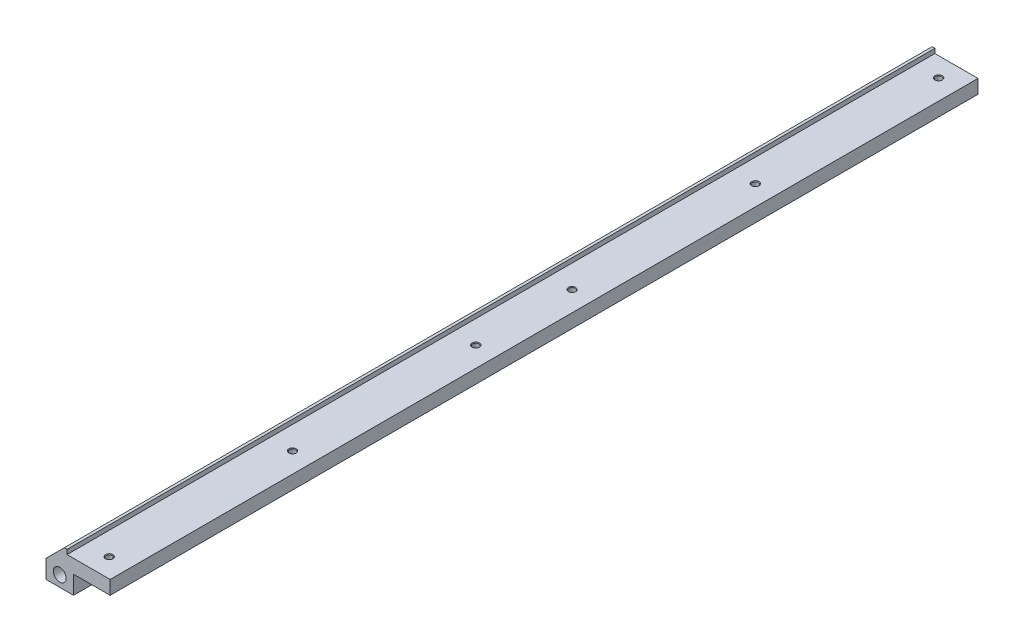
ISO-10303-21;
HEADER;
FILE_DESCRIPTION(('STEP AP214'),'2;1');
FILE_NAME('part.step','',(''),(''),'','','');
FILE_SCHEMA(('AUTOMOTIVE_DESIGN { 1 0 10303 214 1 1 1 1 }'));
ENDSEC;
DATA;
#1=APPLICATION_CONTEXT('core data for automotive mechanical design processes');
#2=APPLICATION_PROTOCOL_DEFINITION('international standard','automotive_design',2000,#1);
#3=PRODUCT_CONTEXT('',#1,'mechanical');
#4=PRODUCT('Part','Part','',(#3));
#5=PRODUCT_RELATED_PRODUCT_CATEGORY('part','',(#4));
#6=PRODUCT_DEFINITION_FORMATION('','',#4);
#7=PRODUCT_DEFINITION_CONTEXT('part definition',#1,'design');
#8=PRODUCT_DEFINITION('design','',#6,#7);
#9=PRODUCT_DEFINITION_SHAPE('','',#8);
#10=(LENGTH_UNIT() NAMED_UNIT(*) SI_UNIT(.MILLI.,.METRE.));
#11=(NAMED_UNIT(*) PLANE_ANGLE_UNIT() SI_UNIT($,.RADIAN.));
#12=(NAMED_UNIT(*) SI_UNIT($,.STERADIAN.) SOLID_ANGLE_UNIT());
#13=UNCERTAINTY_MEASURE_WITH_UNIT(LENGTH_MEASURE(1.E-05),#10,'distance_accuracy_value','');
#14=(GEOMETRIC_REPRESENTATION_CONTEXT(3) GLOBAL_UNCERTAINTY_ASSIGNED_CONTEXT((#13)) GLOBAL_UNIT_ASSIGNED_CONTEXT((#10,
#11,#12)) REPRESENTATION_CONTEXT('',''));
#15=CARTESIAN_POINT('',(0.,0.,0.));
#16=DIRECTION('',(0.,0.,1.));
#17=DIRECTION('',(1.,0.,0.));
#18=AXIS2_PLACEMENT_3D('',#15,#16,#17);
#19=CARTESIAN_POINT('',(-15.,28.,473.5));
#20=DIRECTION('',(1.,0.,0.));
#21=DIRECTION('',(0.,1.,0.));
#22=AXIS2_PLACEMENT_3D('',#19,#20,#21);
#23=PLANE('',#22);
#24=DIRECTION('',(0.,-1.,0.));
#25=VECTOR('',#24,1.);
#26=CARTESIAN_POINT('',(-15.,28.,473.5));
#27=LINE('',#26,#25);
#28=CARTESIAN_POINT('',(-15.,7.99999999999998,473.5));
#29=VERTEX_POINT('',#28);
#30=CARTESIAN_POINT('',(-15.,-12.,473.5));
#31=VERTEX_POINT('',#30);
#32=EDGE_CURVE('E286',#29,#31,#27,.T.);
#33=ORIENTED_EDGE('',*,*,#32,.F.);
#34=DIRECTION('',(0.,0.,-1.));
#35=VECTOR('',#34,1.);
#36=CARTESIAN_POINT('',(-15.,7.99999999999998,473.5));
#37=LINE('',#36,#35);
#38=CARTESIAN_POINT('',(-15.,7.99999999999998,-473.5));
#39=VERTEX_POINT('',#38);
#40=EDGE_CURVE('E323',#29,#39,#37,.T.);
#41=ORIENTED_EDGE('',*,*,#40,.T.);
#42=DIRECTION('',(0.,-1.,0.));
#43=VECTOR('',#42,1.);
#44=CARTESIAN_POINT('',(-15.,28.,-473.5));
#45=LINE('',#44,#43);
#46=CARTESIAN_POINT('',(-15.,-12.,-473.5));
#47=VERTEX_POINT('',#46);
#48=EDGE_CURVE('E285',#39,#47,#45,.T.);
#49=ORIENTED_EDGE('',*,*,#48,.T.);
#50=DIRECTION('',(0.,0.,-1.));
#51=VECTOR('',#50,1.);
#52=CARTESIAN_POINT('',(-15.,-12.,473.5));
#53=LINE('',#52,#51);
#54=EDGE_CURVE('E320',#31,#47,#53,.T.);
#55=ORIENTED_EDGE('',*,*,#54,.F.);
#56=EDGE_LOOP('',(#33,#41,#49,#55));
#57=FACE_BOUND('',#56,.T.);
#58=ADVANCED_FACE('F37',(#57),#23,.F.);
#59=CARTESIAN_POINT('',(-15.,-12.,473.5));
#60=DIRECTION('',(0.,1.,0.));
#61=DIRECTION('',(0.,0.,1.));
#62=AXIS2_PLACEMENT_3D('',#59,#60,#61);
#63=PLANE('',#62);
#64=DIRECTION('',(1.,0.,0.));
#65=VECTOR('',#64,1.);
#66=CARTESIAN_POINT('',(-15.,-12.,-473.5));
#67=LINE('',#66,#65);
#68=CARTESIAN_POINT('',(14.9999999999999,-12.,-473.5));
#69=VERTEX_POINT('',#68);
#70=EDGE_CURVE('E302',#47,#69,#67,.T.);
#71=ORIENTED_EDGE('',*,*,#70,.T.);
#72=DIRECTION('',(0.,0.,-1.));
#73=VECTOR('',#72,1.);
#74=CARTESIAN_POINT('',(14.9999999999999,-12.,-373.5));
#75=LINE('',#74,#73);
#76=CARTESIAN_POINT('',(14.9999999999999,-12.,-373.5));
#77=VERTEX_POINT('',#76);
#78=EDGE_CURVE('E173',#77,#69,#75,.T.);
#79=ORIENTED_EDGE('',*,*,#78,.F.);
#80=DIRECTION('',(1.,0.,0.));
#81=VECTOR('',#80,1.);
#82=CARTESIAN_POINT('',(14.9999999999999,-12.,-373.5));
#83=LINE('',#82,#81);
#84=CARTESIAN_POINT('',(11.,-12.,-373.5));
#85=VERTEX_POINT('',#84);
#86=EDGE_CURVE('E213',#85,#77,#83,.T.);
#87=ORIENTED_EDGE('',*,*,#86,.F.);
#88=CARTESIAN_POINT('',(11.,-12.,-352.5));
#89=DIRECTION('',(0.,-1.,0.));
#90=DIRECTION('',(0.,0.,1.));
#91=AXIS2_PLACEMENT_3D('',#88,#89,#90);
#92=CIRCLE('',#91,21.);
#93=CARTESIAN_POINT('',(-10.,-12.,-352.5));
#94=VERTEX_POINT('',#93);
#95=EDGE_CURVE('E210',#94,#85,#92,.T.);
#96=ORIENTED_EDGE('',*,*,#95,.F.);
#97=DIRECTION('',(0.,0.,-1.));
#98=VECTOR('',#97,1.);
#99=CARTESIAN_POINT('',(-10.,-12.,-352.5));
#100=LINE('',#99,#98);
#101=CARTESIAN_POINT('',(-10.,-12.,352.5));
#102=VERTEX_POINT('',#101);
#103=EDGE_CURVE('E207',#102,#94,#100,.T.);
#104=ORIENTED_EDGE('',*,*,#103,.F.);
#105=CARTESIAN_POINT('',(11.,-12.,352.5));
#106=DIRECTION('',(0.,-1.,0.));
#107=DIRECTION('',(0.,0.,-1.));
#108=AXIS2_PLACEMENT_3D('',#105,#106,#107);
#109=CIRCLE('',#108,21.);
#110=CARTESIAN_POINT('',(11.,-12.,373.5));
#111=VERTEX_POINT('',#110);
#112=EDGE_CURVE('E204',#111,#102,#109,.T.);
#113=ORIENTED_EDGE('',*,*,#112,.F.);
#114=DIRECTION('',(-1.,0.,0.));
#115=VECTOR('',#114,1.);
#116=CARTESIAN_POINT('',(14.9999999999998,-12.,373.5));
#117=LINE('',#116,#115);
#118=CARTESIAN_POINT('',(14.9999999999998,-12.,373.5));
#119=VERTEX_POINT('',#118);
#120=EDGE_CURVE('E201',#119,#111,#117,.T.);
#121=ORIENTED_EDGE('',*,*,#120,.F.);
#122=DIRECTION('',(0.,0.,-1.));
#123=VECTOR('',#122,1.);
#124=CARTESIAN_POINT('',(14.9999999999999,-12.,473.5));
#125=LINE('',#124,#123);
#126=CARTESIAN_POINT('',(14.9999999999999,-12.,473.5));
#127=VERTEX_POINT('',#126);
#128=EDGE_CURVE('E169',#127,#119,#125,.T.);
#129=ORIENTED_EDGE('',*,*,#128,.F.);
#130=DIRECTION('',(1.,0.,0.));
#131=VECTOR('',#130,1.);
#132=CARTESIAN_POINT('',(-15.,-12.,473.5));
#133=LINE('',#132,#131);
#134=EDGE_CURVE('E288',#31,#127,#133,.T.);
#135=ORIENTED_EDGE('',*,*,#134,.F.);
#136=ORIENTED_EDGE('',*,*,#54,.T.);
#137=EDGE_LOOP('',(#71,#79,#87,#96,#104,#113,#121,#129,#135,#136));
#138=FACE_BOUND('',#137,.T.);
#139=ADVANCED_FACE('F341',(#138),#63,.F.);
#140=CARTESIAN_POINT('',(55.,23.,473.5));
#141=DIRECTION('',(-1.,0.,0.));
#142=DIRECTION('',(0.,0.,1.));
#143=AXIS2_PLACEMENT_3D('',#140,#141,#142);
#144=PLANE('',#143);
#145=DIRECTION('',(0.,1.,0.));
#146=VECTOR('',#145,1.);
#147=CARTESIAN_POINT('',(55.,23.,473.5));
#148=LINE('',#147,#146);
#149=CARTESIAN_POINT('',(55.,8.,473.5));
#150=VERTEX_POINT('',#149);
#151=CARTESIAN_POINT('',(55.,23.,473.5));
#152=VERTEX_POINT('',#151);
#153=EDGE_CURVE('E292',#150,#152,#148,.T.);
#154=ORIENTED_EDGE('',*,*,#153,.F.);
#155=DIRECTION('',(0.,0.,1.));
#156=VECTOR('',#155,1.);
#157=CARTESIAN_POINT('',(55.,8.,473.5));
#158=LINE('',#157,#156);
#159=CARTESIAN_POINT('',(55.0000000000001,8.,-473.5));
#160=VERTEX_POINT('',#159);
#161=EDGE_CURVE('E170',#160,#150,#158,.T.);
#162=ORIENTED_EDGE('',*,*,#161,.F.);
#163=DIRECTION('',(0.,1.,0.));
#164=VECTOR('',#163,1.);
#165=CARTESIAN_POINT('',(55.,23.,-473.5));
#166=LINE('',#165,#164);
#167=CARTESIAN_POINT('',(55.,23.,-473.5));
#168=VERTEX_POINT('',#167);
#169=EDGE_CURVE('E305',#160,#168,#166,.T.);
#170=ORIENTED_EDGE('',*,*,#169,.T.);
#171=DIRECTION('',(0.,0.,-1.));
#172=VECTOR('',#171,1.);
#173=CARTESIAN_POINT('',(55.,23.,473.5));
#174=LINE('',#173,#172);
#175=EDGE_CURVE('E317',#152,#168,#174,.T.);
#176=ORIENTED_EDGE('',*,*,#175,.F.);
#177=EDGE_LOOP('',(#154,#162,#170,#176));
#178=FACE_BOUND('',#177,.T.);
#179=ADVANCED_FACE('F364',(#178),#144,.F.);
#180=CARTESIAN_POINT('',(8.,23.,473.5));
#181=DIRECTION('',(0.,-1.,0.));
#182=DIRECTION('',(0.,0.,-1.));
#183=AXIS2_PLACEMENT_3D('',#180,#181,#182);
#184=PLANE('',#183);
#185=CARTESIAN_POINT('',(33.,23.,452.5));
#186=DIRECTION('',(0.,1.,0.));
#187=DIRECTION('',(0.,0.,1.));
#188=AXIS2_PLACEMENT_3D('',#185,#186,#187);
#189=CIRCLE('',#188,4.025);
#190=CARTESIAN_POINT('',(33.,23.,456.525));
#191=VERTEX_POINT('',#190);
#192=EDGE_CURVE('E249',#191,#191,#189,.T.);
#193=ORIENTED_EDGE('',*,*,#192,.F.);
#194=EDGE_LOOP('',(#193));
#195=FACE_BOUND('',#194,.T.);
#196=CARTESIAN_POINT('',(33.,23.,-52.5));
#197=DIRECTION('',(0.,1.,0.));
#198=DIRECTION('',(0.,0.,1.));
#199=AXIS2_PLACEMENT_3D('',#196,#197,#198);
#200=CIRCLE('',#199,4.025);
#201=CARTESIAN_POINT('',(33.,23.,-48.475));
#202=VERTEX_POINT('',#201);
#203=EDGE_CURVE('E255',#202,#202,#200,.T.);
#204=ORIENTED_EDGE('',*,*,#203,.F.);
#205=EDGE_LOOP('',(#204));
#206=FACE_BOUND('',#205,.T.);
#207=CARTESIAN_POINT('',(33.,23.,252.5));
#208=DIRECTION('',(0.,1.,0.));
#209=DIRECTION('',(0.,0.,1.));
#210=AXIS2_PLACEMENT_3D('',#207,#208,#209);
#211=CIRCLE('',#210,4.025);
#212=CARTESIAN_POINT('',(33.,23.,256.525));
#213=VERTEX_POINT('',#212);
#214=EDGE_CURVE('E261',#213,#213,#211,.T.);
#215=ORIENTED_EDGE('',*,*,#214,.F.);
#216=EDGE_LOOP('',(#215));
#217=FACE_BOUND('',#216,.T.);
#218=CARTESIAN_POINT('',(33.,23.,-252.5));
#219=DIRECTION('',(0.,1.,0.));
#220=DIRECTION('',(0.,0.,1.));
#221=AXIS2_PLACEMENT_3D('',#218,#219,#220);
#222=CIRCLE('',#221,4.025);
#223=CARTESIAN_POINT('',(33.,23.,-248.475));
#224=VERTEX_POINT('',#223);
#225=EDGE_CURVE('E267',#224,#224,#222,.T.);
#226=ORIENTED_EDGE('',*,*,#225,.F.);
#227=EDGE_LOOP('',(#226));
#228=FACE_BOUND('',#227,.T.);
#229=CARTESIAN_POINT('',(33.,23.,52.5));
#230=DIRECTION('',(0.,1.,0.));
#231=DIRECTION('',(0.,0.,1.));
#232=AXIS2_PLACEMENT_3D('',#229,#230,#231);
#233=CIRCLE('',#232,4.025);
#234=CARTESIAN_POINT('',(33.,23.,56.525));
#235=VERTEX_POINT('',#234);
#236=EDGE_CURVE('E273',#235,#235,#233,.T.);
#237=ORIENTED_EDGE('',*,*,#236,.F.);
#238=EDGE_LOOP('',(#237));
#239=FACE_BOUND('',#238,.T.);
#240=CARTESIAN_POINT('',(33.,23.,-452.5));
#241=DIRECTION('',(0.,1.,0.));
#242=DIRECTION('',(0.,0.,1.));
#243=AXIS2_PLACEMENT_3D('',#240,#241,#242);
#244=CIRCLE('',#243,4.025);
#245=CARTESIAN_POINT('',(33.,23.,-448.475));
#246=VERTEX_POINT('',#245);
#247=EDGE_CURVE('E279',#246,#246,#244,.T.);
#248=ORIENTED_EDGE('',*,*,#247,.F.);
#249=EDGE_LOOP('',(#248));
#250=FACE_BOUND('',#249,.T.);
#251=DIRECTION('',(-1.,0.,0.));
#252=VECTOR('',#251,1.);
#253=CARTESIAN_POINT('',(8.,23.,-473.5));
#254=LINE('',#253,#252);
#255=CARTESIAN_POINT('',(8.,23.,-473.5));
#256=VERTEX_POINT('',#255);
#257=EDGE_CURVE('E307',#168,#256,#254,.T.);
#258=ORIENTED_EDGE('',*,*,#257,.T.);
#259=DIRECTION('',(0.,0.,-1.));
#260=VECTOR('',#259,1.);
#261=CARTESIAN_POINT('',(8.,23.,473.5));
#262=LINE('',#261,#260);
#263=CARTESIAN_POINT('',(8.,23.,473.5));
#264=VERTEX_POINT('',#263);
#265=EDGE_CURVE('E314',#264,#256,#262,.T.);
#266=ORIENTED_EDGE('',*,*,#265,.F.);
#267=DIRECTION('',(-1.,0.,0.));
#268=VECTOR('',#267,1.);
#269=CARTESIAN_POINT('',(8.,23.,473.5));
#270=LINE('',#269,#268);
#271=EDGE_CURVE('E294',#152,#264,#270,.T.);
#272=ORIENTED_EDGE('',*,*,#271,.F.);
#273=ORIENTED_EDGE('',*,*,#175,.T.);
#274=EDGE_LOOP('',(#258,#266,#272,#273));
#275=FACE_BOUND('',#274,.T.);
#276=ADVANCED_FACE('F369',(#195,#206,#217,#228,#239,#250,#275),#184,.F.);
#277=CARTESIAN_POINT('',(8.,28.,473.5));
#278=DIRECTION('',(-1.,0.,0.));
#279=DIRECTION('',(0.,0.,1.));
#280=AXIS2_PLACEMENT_3D('',#277,#278,#279);
#281=PLANE('',#280);
#282=DIRECTION('',(0.,1.,0.));
#283=VECTOR('',#282,1.);
#284=CARTESIAN_POINT('',(8.,28.,-473.5));
#285=LINE('',#284,#283);
#286=CARTESIAN_POINT('',(8.,28.,-473.5));
#287=VERTEX_POINT('',#286);
#288=EDGE_CURVE('E309',#256,#287,#285,.T.);
#289=ORIENTED_EDGE('',*,*,#288,.T.);
#290=DIRECTION('',(0.,0.,-1.));
#291=VECTOR('',#290,1.);
#292=CARTESIAN_POINT('',(8.,28.,473.5));
#293=LINE('',#292,#291);
#294=CARTESIAN_POINT('',(8.,28.,473.5));
#295=VERTEX_POINT('',#294);
#296=EDGE_CURVE('E300',#295,#287,#293,.T.);
#297=ORIENTED_EDGE('',*,*,#296,.F.);
#298=DIRECTION('',(0.,1.,0.));
#299=VECTOR('',#298,1.);
#300=CARTESIAN_POINT('',(8.,28.,473.5));
#301=LINE('',#300,#299);
#302=EDGE_CURVE('E296',#264,#295,#301,.T.);
#303=ORIENTED_EDGE('',*,*,#302,.F.);
#304=ORIENTED_EDGE('',*,*,#265,.T.);
#305=EDGE_LOOP('',(#289,#297,#303,#304));
#306=FACE_BOUND('',#305,.T.);
#307=ADVANCED_FACE('F373',(#306),#281,.F.);
#308=CARTESIAN_POINT('',(-15.,28.,473.5));
#309=DIRECTION('',(0.,-1.,0.));
#310=DIRECTION('',(0.,0.,-1.));
#311=AXIS2_PLACEMENT_3D('',#308,#309,#310);
#312=PLANE('',#311);
#313=DIRECTION('',(-1.,0.,0.));
#314=VECTOR('',#313,1.);
#315=CARTESIAN_POINT('',(-15.,28.,-473.5));
#316=LINE('',#315,#314);
#317=CARTESIAN_POINT('',(5.00000000000013,28.,-473.5));
#318=VERTEX_POINT('',#317);
#319=EDGE_CURVE('E289',#287,#318,#316,.T.);
#320=ORIENTED_EDGE('',*,*,#319,.T.);
#321=DIRECTION('',(0.,0.,1.));
#322=VECTOR('',#321,1.);
#323=CARTESIAN_POINT('',(5.00000000000013,28.,473.5));
#324=LINE('',#323,#322);
#325=CARTESIAN_POINT('',(5.00000000000013,28.,473.5));
#326=VERTEX_POINT('',#325);
#327=EDGE_CURVE('E45',#318,#326,#324,.T.);
#328=ORIENTED_EDGE('',*,*,#327,.T.);
#329=DIRECTION('',(-1.,0.,0.));
#330=VECTOR('',#329,1.);
#331=CARTESIAN_POINT('',(-15.,28.,473.5));
#332=LINE('',#331,#330);
#333=EDGE_CURVE('E298',#295,#326,#332,.T.);
#334=ORIENTED_EDGE('',*,*,#333,.F.);
#335=ORIENTED_EDGE('',*,*,#296,.T.);
#336=EDGE_LOOP('',(#320,#328,#334,#335));
#337=FACE_BOUND('',#336,.T.);
#338=ADVANCED_FACE('F377',(#337),#312,.F.);
#339=CARTESIAN_POINT('',(-15.,-12.,473.5));
#340=DIRECTION('',(0.,0.,1.));
#341=DIRECTION('',(1.,0.,0.));
#342=AXIS2_PLACEMENT_3D('',#339,#340,#341);
#343=PLANE('',#342);
#344=CARTESIAN_POINT('',(0.,0.,473.5));
#345=DIRECTION('',(0.,0.,1.));
#346=DIRECTION('',(1.,0.,0.));
#347=AXIS2_PLACEMENT_3D('',#344,#345,#346);
#348=CIRCLE('',#347,6.99999999999999);
#349=CARTESIAN_POINT('',(6.99999999999999,0.,473.5));
#350=VERTEX_POINT('',#349);
#351=EDGE_CURVE('E158',#350,#350,#348,.T.);
#352=ORIENTED_EDGE('',*,*,#351,.F.);
#353=EDGE_LOOP('',(#352));
#354=FACE_BOUND('',#353,.T.);
#355=ORIENTED_EDGE('',*,*,#333,.T.);
#356=DIRECTION('',(0.707106781186549,0.707106781186546,0.));
#357=VECTOR('',#356,1.);
#358=CARTESIAN_POINT('',(-25.,-1.99999999999995,473.5));
#359=LINE('',#358,#357);
#360=EDGE_CURVE('E11',#326,#29,#359,.F.);
#361=ORIENTED_EDGE('',*,*,#360,.T.);
#362=ORIENTED_EDGE('',*,*,#32,.T.);
#363=ORIENTED_EDGE('',*,*,#134,.T.);
#364=DIRECTION('',(0.,-1.,0.));
#365=VECTOR('',#364,1.);
#366=CARTESIAN_POINT('',(14.9999999999999,8.,473.5));
#367=LINE('',#366,#365);
#368=CARTESIAN_POINT('',(14.9999999999999,8.,473.5));
#369=VERTEX_POINT('',#368);
#370=EDGE_CURVE('E198',#369,#127,#367,.T.);
#371=ORIENTED_EDGE('',*,*,#370,.F.);
#372=DIRECTION('',(-1.,0.,0.));
#373=VECTOR('',#372,1.);
#374=CARTESIAN_POINT('',(55.,8.,473.5));
#375=LINE('',#374,#373);
#376=EDGE_CURVE('E172',#150,#369,#375,.T.);
#377=ORIENTED_EDGE('',*,*,#376,.F.);
#378=ORIENTED_EDGE('',*,*,#153,.T.);
#379=ORIENTED_EDGE('',*,*,#271,.T.);
#380=ORIENTED_EDGE('',*,*,#302,.T.);
#381=EDGE_LOOP('',(#355,#361,#362,#363,#371,#377,#378,#379,#380));
#382=FACE_BOUND('',#381,.T.);
#383=ADVANCED_FACE('F346',(#354,#382),#343,.T.);
#384=CARTESIAN_POINT('',(-15.,-12.,-473.5));
#385=DIRECTION('',(0.,0.,1.));
#386=DIRECTION('',(1.,0.,0.));
#387=AXIS2_PLACEMENT_3D('',#384,#385,#386);
#388=PLANE('',#387);
#389=CARTESIAN_POINT('',(0.,0.,-473.5));
#390=DIRECTION('',(0.,0.,-1.));
#391=DIRECTION('',(-1.,0.,0.));
#392=AXIS2_PLACEMENT_3D('',#389,#390,#391);
#393=CIRCLE('',#392,6.99999999999999);
#394=CARTESIAN_POINT('',(-6.99999999999999,0.,-473.5));
#395=VERTEX_POINT('',#394);
#396=EDGE_CURVE('E159',#395,#395,#393,.T.);
#397=ORIENTED_EDGE('',*,*,#396,.F.);
#398=EDGE_LOOP('',(#397));
#399=FACE_BOUND('',#398,.T.);
#400=ORIENTED_EDGE('',*,*,#48,.F.);
#401=DIRECTION('',(-0.707106781186549,-0.707106781186546,0.));
#402=VECTOR('',#401,1.);
#403=CARTESIAN_POINT('',(-15.,7.99999999999998,-473.5));
#404=LINE('',#403,#402);
#405=EDGE_CURVE('E59',#39,#318,#404,.F.);
#406=ORIENTED_EDGE('',*,*,#405,.T.);
#407=ORIENTED_EDGE('',*,*,#319,.F.);
#408=ORIENTED_EDGE('',*,*,#288,.F.);
#409=ORIENTED_EDGE('',*,*,#257,.F.);
#410=ORIENTED_EDGE('',*,*,#169,.F.);
#411=DIRECTION('',(1.,0.,0.));
#412=VECTOR('',#411,1.);
#413=CARTESIAN_POINT('',(55.0000000000001,8.,-473.5));
#414=LINE('',#413,#412);
#415=CARTESIAN_POINT('',(14.9999999999999,8.,-473.5));
#416=VERTEX_POINT('',#415);
#417=EDGE_CURVE('E196',#416,#160,#414,.T.);
#418=ORIENTED_EDGE('',*,*,#417,.F.);
#419=DIRECTION('',(0.,-1.,0.));
#420=VECTOR('',#419,1.);
#421=CARTESIAN_POINT('',(14.9999999999999,8.,-473.5));
#422=LINE('',#421,#420);
#423=EDGE_CURVE('E217',#416,#69,#422,.T.);
#424=ORIENTED_EDGE('',*,*,#423,.T.);
#425=ORIENTED_EDGE('',*,*,#70,.F.);
#426=EDGE_LOOP('',(#400,#406,#407,#408,#409,#410,#418,#424,#425));
#427=FACE_BOUND('',#426,.T.);
#428=ADVANCED_FACE('F335',(#399,#427),#388,.F.);
#429=CARTESIAN_POINT('',(33.,23.,-452.5));
#430=DIRECTION('',(0.,1.,0.));
#431=DIRECTION('',(0.,0.,1.));
#432=AXIS2_PLACEMENT_3D('',#429,#430,#431);
#433=CYLINDRICAL_SURFACE('',#432,3.4);
#434=CARTESIAN_POINT('',(33.,8.,-452.5));
#435=DIRECTION('',(0.,1.,0.));
#436=DIRECTION('',(0.,0.,1.));
#437=AXIS2_PLACEMENT_3D('',#434,#435,#436);
#438=CIRCLE('',#437,3.4);
#439=CARTESIAN_POINT('',(33.,8.,-449.1));
#440=VERTEX_POINT('',#439);
#441=EDGE_CURVE('E246',#440,#440,#438,.F.);
#442=ORIENTED_EDGE('',*,*,#441,.T.);
#443=EDGE_LOOP('',(#442));
#444=FACE_BOUND('',#443,.T.);
#445=CARTESIAN_POINT('',(33.,22.375,-452.5));
#446=DIRECTION('',(0.,1.,0.));
#447=DIRECTION('',(0.,0.,1.));
#448=AXIS2_PLACEMENT_3D('',#445,#446,#447);
#449=CIRCLE('',#448,3.4);
#450=CARTESIAN_POINT('',(33.,22.375,-449.1));
#451=VERTEX_POINT('',#450);
#452=EDGE_CURVE('E282',#451,#451,#449,.T.);
#453=ORIENTED_EDGE('',*,*,#452,.T.);
#454=EDGE_LOOP('',(#453));
#455=FACE_BOUND('',#454,.T.);
#456=ADVANCED_FACE('F383',(#444,#455),#433,.F.);
#457=CARTESIAN_POINT('',(33.,23.,-452.5));
#458=DIRECTION('',(0.,1.,0.));
#459=DIRECTION('',(0.,0.,1.));
#460=AXIS2_PLACEMENT_3D('',#457,#458,#459);
#461=CONICAL_SURFACE('',#460,4.025,0.785398163397446);
#462=ORIENTED_EDGE('',*,*,#452,.F.);
#463=EDGE_LOOP('',(#462));
#464=FACE_BOUND('',#463,.T.);
#465=ORIENTED_EDGE('',*,*,#247,.T.);
#466=EDGE_LOOP('',(#465));
#467=FACE_BOUND('',#466,.T.);
#468=ADVANCED_FACE('F390',(#464,#467),#461,.F.);
#469=CARTESIAN_POINT('',(33.,23.,52.5));
#470=DIRECTION('',(0.,1.,0.));
#471=DIRECTION('',(0.,0.,1.));
#472=AXIS2_PLACEMENT_3D('',#469,#470,#471);
#473=CYLINDRICAL_SURFACE('',#472,3.4);
#474=CARTESIAN_POINT('',(33.,8.,52.5));
#475=DIRECTION('',(0.,1.,0.));
#476=DIRECTION('',(0.,0.,1.));
#477=AXIS2_PLACEMENT_3D('',#474,#475,#476);
#478=CIRCLE('',#477,3.4);
#479=CARTESIAN_POINT('',(33.,8.,55.9));
#480=VERTEX_POINT('',#479);
#481=EDGE_CURVE('E243',#480,#480,#478,.F.);
#482=ORIENTED_EDGE('',*,*,#481,.T.);
#483=EDGE_LOOP('',(#482));
#484=FACE_BOUND('',#483,.T.);
#485=CARTESIAN_POINT('',(33.,22.375,52.5));
#486=DIRECTION('',(0.,1.,0.));
#487=DIRECTION('',(0.,0.,1.));
#488=AXIS2_PLACEMENT_3D('',#485,#486,#487);
#489=CIRCLE('',#488,3.4);
#490=CARTESIAN_POINT('',(33.,22.375,55.9));
#491=VERTEX_POINT('',#490);
#492=EDGE_CURVE('E276',#491,#491,#489,.T.);
#493=ORIENTED_EDGE('',*,*,#492,.T.);
#494=EDGE_LOOP('',(#493));
#495=FACE_BOUND('',#494,.T.);
#496=ADVANCED_FACE('F394',(#484,#495),#473,.F.);
#497=CARTESIAN_POINT('',(33.,23.,52.5));
#498=DIRECTION('',(0.,1.,0.));
#499=DIRECTION('',(0.,0.,1.));
#500=AXIS2_PLACEMENT_3D('',#497,#498,#499);
#501=CONICAL_SURFACE('',#500,4.025,0.785398163397446);
#502=ORIENTED_EDGE('',*,*,#492,.F.);
#503=EDGE_LOOP('',(#502));
#504=FACE_BOUND('',#503,.T.);
#505=ORIENTED_EDGE('',*,*,#236,.T.);
#506=EDGE_LOOP('',(#505));
#507=FACE_BOUND('',#506,.T.);
#508=ADVANCED_FACE('F398',(#504,#507),#501,.F.);
#509=CARTESIAN_POINT('',(33.,23.,-252.5));
#510=DIRECTION('',(0.,1.,0.));
#511=DIRECTION('',(0.,0.,1.));
#512=AXIS2_PLACEMENT_3D('',#509,#510,#511);
#513=CYLINDRICAL_SURFACE('',#512,3.4);
#514=CARTESIAN_POINT('',(33.,8.,-252.5));
#515=DIRECTION('',(0.,1.,0.));
#516=DIRECTION('',(0.,0.,1.));
#517=AXIS2_PLACEMENT_3D('',#514,#515,#516);
#518=CIRCLE('',#517,3.4);
#519=CARTESIAN_POINT('',(33.,8.,-249.1));
#520=VERTEX_POINT('',#519);
#521=EDGE_CURVE('E240',#520,#520,#518,.F.);
#522=ORIENTED_EDGE('',*,*,#521,.T.);
#523=EDGE_LOOP('',(#522));
#524=FACE_BOUND('',#523,.T.);
#525=CARTESIAN_POINT('',(33.,22.375,-252.5));
#526=DIRECTION('',(0.,1.,0.));
#527=DIRECTION('',(0.,0.,1.));
#528=AXIS2_PLACEMENT_3D('',#525,#526,#527);
#529=CIRCLE('',#528,3.4);
#530=CARTESIAN_POINT('',(33.,22.375,-249.1));
#531=VERTEX_POINT('',#530);
#532=EDGE_CURVE('E270',#531,#531,#529,.T.);
#533=ORIENTED_EDGE('',*,*,#532,.T.);
#534=EDGE_LOOP('',(#533));
#535=FACE_BOUND('',#534,.T.);
#536=ADVANCED_FACE('F402',(#524,#535),#513,.F.);
#537=CARTESIAN_POINT('',(33.,23.,-252.5));
#538=DIRECTION('',(0.,1.,0.));
#539=DIRECTION('',(0.,0.,1.));
#540=AXIS2_PLACEMENT_3D('',#537,#538,#539);
#541=CONICAL_SURFACE('',#540,4.025,0.785398163397446);
#542=ORIENTED_EDGE('',*,*,#532,.F.);
#543=EDGE_LOOP('',(#542));
#544=FACE_BOUND('',#543,.T.);
#545=ORIENTED_EDGE('',*,*,#225,.T.);
#546=EDGE_LOOP('',(#545));
#547=FACE_BOUND('',#546,.T.);
#548=ADVANCED_FACE('F406',(#544,#547),#541,.F.);
#549=CARTESIAN_POINT('',(33.,23.,252.5));
#550=DIRECTION('',(0.,1.,0.));
#551=DIRECTION('',(0.,0.,1.));
#552=AXIS2_PLACEMENT_3D('',#549,#550,#551);
#553=CYLINDRICAL_SURFACE('',#552,3.4);
#554=CARTESIAN_POINT('',(33.,8.,252.5));
#555=DIRECTION('',(0.,1.,0.));
#556=DIRECTION('',(0.,0.,1.));
#557=AXIS2_PLACEMENT_3D('',#554,#555,#556);
#558=CIRCLE('',#557,3.4);
#559=CARTESIAN_POINT('',(33.,8.,255.9));
#560=VERTEX_POINT('',#559);
#561=EDGE_CURVE('E237',#560,#560,#558,.F.);
#562=ORIENTED_EDGE('',*,*,#561,.T.);
#563=EDGE_LOOP('',(#562));
#564=FACE_BOUND('',#563,.T.);
#565=CARTESIAN_POINT('',(33.,22.375,252.5));
#566=DIRECTION('',(0.,1.,0.));
#567=DIRECTION('',(0.,0.,1.));
#568=AXIS2_PLACEMENT_3D('',#565,#566,#567);
#569=CIRCLE('',#568,3.4);
#570=CARTESIAN_POINT('',(33.,22.375,255.9));
#571=VERTEX_POINT('',#570);
#572=EDGE_CURVE('E264',#571,#571,#569,.T.);
#573=ORIENTED_EDGE('',*,*,#572,.T.);
#574=EDGE_LOOP('',(#573));
#575=FACE_BOUND('',#574,.T.);
#576=ADVANCED_FACE('F410',(#564,#575),#553,.F.);
#577=CARTESIAN_POINT('',(33.,23.,252.5));
#578=DIRECTION('',(0.,1.,0.));
#579=DIRECTION('',(0.,0.,1.));
#580=AXIS2_PLACEMENT_3D('',#577,#578,#579);
#581=CONICAL_SURFACE('',#580,4.025,0.785398163397446);
#582=ORIENTED_EDGE('',*,*,#572,.F.);
#583=EDGE_LOOP('',(#582));
#584=FACE_BOUND('',#583,.T.);
#585=ORIENTED_EDGE('',*,*,#214,.T.);
#586=EDGE_LOOP('',(#585));
#587=FACE_BOUND('',#586,.T.);
#588=ADVANCED_FACE('F414',(#584,#587),#581,.F.);
#589=CARTESIAN_POINT('',(33.,23.,-52.5));
#590=DIRECTION('',(0.,1.,0.));
#591=DIRECTION('',(0.,0.,1.));
#592=AXIS2_PLACEMENT_3D('',#589,#590,#591);
#593=CYLINDRICAL_SURFACE('',#592,3.4);
#594=CARTESIAN_POINT('',(33.,8.,-52.5));
#595=DIRECTION('',(0.,1.,0.));
#596=DIRECTION('',(0.,0.,1.));
#597=AXIS2_PLACEMENT_3D('',#594,#595,#596);
#598=CIRCLE('',#597,3.4);
#599=CARTESIAN_POINT('',(33.,8.,-49.1));
#600=VERTEX_POINT('',#599);
#601=EDGE_CURVE('E234',#600,#600,#598,.F.);
#602=ORIENTED_EDGE('',*,*,#601,.T.);
#603=EDGE_LOOP('',(#602));
#604=FACE_BOUND('',#603,.T.);
#605=CARTESIAN_POINT('',(33.,22.375,-52.5));
#606=DIRECTION('',(0.,1.,0.));
#607=DIRECTION('',(0.,0.,1.));
#608=AXIS2_PLACEMENT_3D('',#605,#606,#607);
#609=CIRCLE('',#608,3.4);
#610=CARTESIAN_POINT('',(33.,22.375,-49.1));
#611=VERTEX_POINT('',#610);
#612=EDGE_CURVE('E258',#611,#611,#609,.T.);
#613=ORIENTED_EDGE('',*,*,#612,.T.);
#614=EDGE_LOOP('',(#613));
#615=FACE_BOUND('',#614,.T.);
#616=ADVANCED_FACE('F418',(#604,#615),#593,.F.);
#617=CARTESIAN_POINT('',(33.,23.,-52.5));
#618=DIRECTION('',(0.,1.,0.));
#619=DIRECTION('',(0.,0.,1.));
#620=AXIS2_PLACEMENT_3D('',#617,#618,#619);
#621=CONICAL_SURFACE('',#620,4.025,0.785398163397446);
#622=ORIENTED_EDGE('',*,*,#612,.F.);
#623=EDGE_LOOP('',(#622));
#624=FACE_BOUND('',#623,.T.);
#625=ORIENTED_EDGE('',*,*,#203,.T.);
#626=EDGE_LOOP('',(#625));
#627=FACE_BOUND('',#626,.T.);
#628=ADVANCED_FACE('F422',(#624,#627),#621,.F.);
#629=CARTESIAN_POINT('',(33.,23.,452.5));
#630=DIRECTION('',(0.,1.,0.));
#631=DIRECTION('',(0.,0.,1.));
#632=AXIS2_PLACEMENT_3D('',#629,#630,#631);
#633=CYLINDRICAL_SURFACE('',#632,3.4);
#634=CARTESIAN_POINT('',(33.,8.,452.5));
#635=DIRECTION('',(0.,1.,0.));
#636=DIRECTION('',(0.,0.,1.));
#637=AXIS2_PLACEMENT_3D('',#634,#635,#636);
#638=CIRCLE('',#637,3.4);
#639=CARTESIAN_POINT('',(33.,8.,455.9));
#640=VERTEX_POINT('',#639);
#641=EDGE_CURVE('E220',#640,#640,#638,.F.);
#642=ORIENTED_EDGE('',*,*,#641,.T.);
#643=EDGE_LOOP('',(#642));
#644=FACE_BOUND('',#643,.T.);
#645=CARTESIAN_POINT('',(33.,22.375,452.5));
#646=DIRECTION('',(0.,1.,0.));
#647=DIRECTION('',(0.,0.,1.));
#648=AXIS2_PLACEMENT_3D('',#645,#646,#647);
#649=CIRCLE('',#648,3.4);
#650=CARTESIAN_POINT('',(33.,22.375,455.9));
#651=VERTEX_POINT('',#650);
#652=EDGE_CURVE('E252',#651,#651,#649,.T.);
#653=ORIENTED_EDGE('',*,*,#652,.T.);
#654=EDGE_LOOP('',(#653));
#655=FACE_BOUND('',#654,.T.);
#656=ADVANCED_FACE('F426',(#644,#655),#633,.F.);
#657=CARTESIAN_POINT('',(33.,23.,452.5));
#658=DIRECTION('',(0.,1.,0.));
#659=DIRECTION('',(0.,0.,1.));
#660=AXIS2_PLACEMENT_3D('',#657,#658,#659);
#661=CONICAL_SURFACE('',#660,4.025,0.785398163397446);
#662=ORIENTED_EDGE('',*,*,#652,.F.);
#663=EDGE_LOOP('',(#662));
#664=FACE_BOUND('',#663,.T.);
#665=ORIENTED_EDGE('',*,*,#192,.T.);
#666=EDGE_LOOP('',(#665));
#667=FACE_BOUND('',#666,.T.);
#668=ADVANCED_FACE('F430',(#664,#667),#661,.F.);
#669=CARTESIAN_POINT('',(11.,8.,-352.5));
#670=DIRECTION('',(0.,1.,0.));
#671=DIRECTION('',(0.,0.,1.));
#672=AXIS2_PLACEMENT_3D('',#669,#670,#671);
#673=PLANE('',#672);
#674=ORIENTED_EDGE('',*,*,#481,.F.);
#675=EDGE_LOOP('',(#674));
#676=FACE_BOUND('',#675,.T.);
#677=ORIENTED_EDGE('',*,*,#561,.F.);
#678=EDGE_LOOP('',(#677));
#679=FACE_BOUND('',#678,.T.);
#680=ORIENTED_EDGE('',*,*,#641,.F.);
#681=EDGE_LOOP('',(#680));
#682=FACE_BOUND('',#681,.T.);
#683=ORIENTED_EDGE('',*,*,#161,.T.);
#684=ORIENTED_EDGE('',*,*,#376,.T.);
#685=DIRECTION('',(0.,0.,-1.));
#686=VECTOR('',#685,1.);
#687=CARTESIAN_POINT('',(14.9999999999999,8.,473.5));
#688=LINE('',#687,#686);
#689=CARTESIAN_POINT('',(14.9999999999998,8.,373.5));
#690=VERTEX_POINT('',#689);
#691=EDGE_CURVE('E176',#369,#690,#688,.T.);
#692=ORIENTED_EDGE('',*,*,#691,.T.);
#693=DIRECTION('',(-1.,0.,0.));
#694=VECTOR('',#693,1.);
#695=CARTESIAN_POINT('',(14.9999999999998,8.,373.5));
#696=LINE('',#695,#694);
#697=CARTESIAN_POINT('',(11.,8.,373.5));
#698=VERTEX_POINT('',#697);
#699=EDGE_CURVE('E179',#690,#698,#696,.T.);
#700=ORIENTED_EDGE('',*,*,#699,.T.);
#701=CARTESIAN_POINT('',(11.,8.,352.5));
#702=DIRECTION('',(0.,-1.,0.));
#703=DIRECTION('',(0.,0.,-1.));
#704=AXIS2_PLACEMENT_3D('',#701,#702,#703);
#705=CIRCLE('',#704,21.);
#706=CARTESIAN_POINT('',(-10.,8.,352.5));
#707=VERTEX_POINT('',#706);
#708=EDGE_CURVE('E182',#698,#707,#705,.T.);
#709=ORIENTED_EDGE('',*,*,#708,.T.);
#710=DIRECTION('',(0.,0.,-1.));
#711=VECTOR('',#710,1.);
#712=CARTESIAN_POINT('',(-10.,8.,-352.5));
#713=LINE('',#712,#711);
#714=CARTESIAN_POINT('',(-10.,8.,-352.5));
#715=VERTEX_POINT('',#714);
#716=EDGE_CURVE('E185',#707,#715,#713,.T.);
#717=ORIENTED_EDGE('',*,*,#716,.T.);
#718=CARTESIAN_POINT('',(11.,8.,-352.5));
#719=DIRECTION('',(0.,-1.,0.));
#720=DIRECTION('',(0.,0.,1.));
#721=AXIS2_PLACEMENT_3D('',#718,#719,#720);
#722=CIRCLE('',#721,21.);
#723=CARTESIAN_POINT('',(11.,8.,-373.5));
#724=VERTEX_POINT('',#723);
#725=EDGE_CURVE('E188',#715,#724,#722,.T.);
#726=ORIENTED_EDGE('',*,*,#725,.T.);
#727=DIRECTION('',(1.,0.,0.));
#728=VECTOR('',#727,1.);
#729=CARTESIAN_POINT('',(14.9999999999999,8.,-373.5));
#730=LINE('',#729,#728);
#731=CARTESIAN_POINT('',(14.9999999999999,8.,-373.5));
#732=VERTEX_POINT('',#731);
#733=EDGE_CURVE('E191',#724,#732,#730,.T.);
#734=ORIENTED_EDGE('',*,*,#733,.T.);
#735=DIRECTION('',(0.,0.,-1.));
#736=VECTOR('',#735,1.);
#737=CARTESIAN_POINT('',(14.9999999999999,8.,-373.5));
#738=LINE('',#737,#736);
#739=EDGE_CURVE('E194',#732,#416,#738,.T.);
#740=ORIENTED_EDGE('',*,*,#739,.T.);
#741=ORIENTED_EDGE('',*,*,#417,.T.);
#742=EDGE_LOOP('',(#683,#684,#692,#700,#709,#717,#726,#734,#740,#741));
#743=FACE_BOUND('',#742,.T.);
#744=ORIENTED_EDGE('',*,*,#601,.F.);
#745=EDGE_LOOP('',(#744));
#746=FACE_BOUND('',#745,.T.);
#747=ORIENTED_EDGE('',*,*,#521,.F.);
#748=EDGE_LOOP('',(#747));
#749=FACE_BOUND('',#748,.T.);
#750=ORIENTED_EDGE('',*,*,#441,.F.);
#751=EDGE_LOOP('',(#750));
#752=FACE_BOUND('',#751,.T.);
#753=ADVANCED_FACE('F433',(#676,#679,#682,#743,#746,#749,#752),#673,.F.);
#754=CARTESIAN_POINT('',(14.9999999999999,8.,-373.5));
#755=DIRECTION('',(-1.,0.,0.));
#756=DIRECTION('',(0.,0.,1.));
#757=AXIS2_PLACEMENT_3D('',#754,#755,#756);
#758=PLANE('',#757);
#759=ORIENTED_EDGE('',*,*,#78,.T.);
#760=ORIENTED_EDGE('',*,*,#423,.F.);
#761=ORIENTED_EDGE('',*,*,#739,.F.);
#762=DIRECTION('',(0.,-1.,0.));
#763=VECTOR('',#762,1.);
#764=CARTESIAN_POINT('',(14.9999999999999,8.,-373.5));
#765=LINE('',#764,#763);
#766=EDGE_CURVE('E221',#732,#77,#765,.T.);
#767=ORIENTED_EDGE('',*,*,#766,.T.);
#768=EDGE_LOOP('',(#759,#760,#761,#767));
#769=FACE_BOUND('',#768,.T.);
#770=ADVANCED_FACE('F454',(#769),#758,.F.);
#771=CARTESIAN_POINT('',(14.9999999999999,8.,-373.5));
#772=DIRECTION('',(0.,0.,-1.));
#773=DIRECTION('',(-1.,0.,0.));
#774=AXIS2_PLACEMENT_3D('',#771,#772,#773);
#775=PLANE('',#774);
#776=ORIENTED_EDGE('',*,*,#86,.T.);
#777=ORIENTED_EDGE('',*,*,#766,.F.);
#778=ORIENTED_EDGE('',*,*,#733,.F.);
#779=DIRECTION('',(0.,-1.,0.));
#780=VECTOR('',#779,1.);
#781=CARTESIAN_POINT('',(11.,8.,-373.5));
#782=LINE('',#781,#780);
#783=EDGE_CURVE('E223',#724,#85,#782,.T.);
#784=ORIENTED_EDGE('',*,*,#783,.T.);
#785=EDGE_LOOP('',(#776,#777,#778,#784));
#786=FACE_BOUND('',#785,.T.);
#787=ADVANCED_FACE('F450',(#786),#775,.F.);
#788=CARTESIAN_POINT('',(11.,8.,-352.5));
#789=DIRECTION('',(0.,-1.,0.));
#790=DIRECTION('',(0.,0.,-1.));
#791=AXIS2_PLACEMENT_3D('',#788,#789,#790);
#792=CYLINDRICAL_SURFACE('',#791,21.);
#793=ORIENTED_EDGE('',*,*,#95,.T.);
#794=ORIENTED_EDGE('',*,*,#783,.F.);
#795=ORIENTED_EDGE('',*,*,#725,.F.);
#796=DIRECTION('',(0.,-1.,0.));
#797=VECTOR('',#796,1.);
#798=CARTESIAN_POINT('',(-10.,8.,-352.5));
#799=LINE('',#798,#797);
#800=EDGE_CURVE('E225',#715,#94,#799,.T.);
#801=ORIENTED_EDGE('',*,*,#800,.T.);
#802=EDGE_LOOP('',(#793,#794,#795,#801));
#803=FACE_BOUND('',#802,.T.);
#804=ADVANCED_FACE('F446',(#803),#792,.F.);
#805=CARTESIAN_POINT('',(-10.,8.,-352.5));
#806=DIRECTION('',(-1.,0.,0.));
#807=DIRECTION('',(0.,0.,1.));
#808=AXIS2_PLACEMENT_3D('',#805,#806,#807);
#809=PLANE('',#808);
#810=ORIENTED_EDGE('',*,*,#103,.T.);
#811=ORIENTED_EDGE('',*,*,#800,.F.);
#812=ORIENTED_EDGE('',*,*,#716,.F.);
#813=DIRECTION('',(0.,-1.,0.));
#814=VECTOR('',#813,1.);
#815=CARTESIAN_POINT('',(-10.,8.,352.5));
#816=LINE('',#815,#814);
#817=EDGE_CURVE('E227',#707,#102,#816,.T.);
#818=ORIENTED_EDGE('',*,*,#817,.T.);
#819=EDGE_LOOP('',(#810,#811,#812,#818));
#820=FACE_BOUND('',#819,.T.);
#821=ADVANCED_FACE('F442',(#820),#809,.F.);
#822=CARTESIAN_POINT('',(11.,8.,352.5));
#823=DIRECTION('',(0.,-1.,0.));
#824=DIRECTION('',(0.,0.,-1.));
#825=AXIS2_PLACEMENT_3D('',#822,#823,#824);
#826=CYLINDRICAL_SURFACE('',#825,21.);
#827=ORIENTED_EDGE('',*,*,#112,.T.);
#828=ORIENTED_EDGE('',*,*,#817,.F.);
#829=ORIENTED_EDGE('',*,*,#708,.F.);
#830=DIRECTION('',(0.,-1.,0.));
#831=VECTOR('',#830,1.);
#832=CARTESIAN_POINT('',(11.,8.,373.5));
#833=LINE('',#832,#831);
#834=EDGE_CURVE('E229',#698,#111,#833,.T.);
#835=ORIENTED_EDGE('',*,*,#834,.T.);
#836=EDGE_LOOP('',(#827,#828,#829,#835));
#837=FACE_BOUND('',#836,.T.);
#838=ADVANCED_FACE('F438',(#837),#826,.F.);
#839=CARTESIAN_POINT('',(14.9999999999998,8.,373.5));
#840=DIRECTION('',(0.,0.,1.));
#841=DIRECTION('',(1.,0.,0.));
#842=AXIS2_PLACEMENT_3D('',#839,#840,#841);
#843=PLANE('',#842);
#844=ORIENTED_EDGE('',*,*,#120,.T.);
#845=ORIENTED_EDGE('',*,*,#834,.F.);
#846=ORIENTED_EDGE('',*,*,#699,.F.);
#847=DIRECTION('',(0.,-1.,0.));
#848=VECTOR('',#847,1.);
#849=CARTESIAN_POINT('',(14.9999999999998,8.,373.5));
#850=LINE('',#849,#848);
#851=EDGE_CURVE('E231',#690,#119,#850,.T.);
#852=ORIENTED_EDGE('',*,*,#851,.T.);
#853=EDGE_LOOP('',(#844,#845,#846,#852));
#854=FACE_BOUND('',#853,.T.);
#855=ADVANCED_FACE('F357',(#854),#843,.F.);
#856=CARTESIAN_POINT('',(14.9999999999999,8.,473.5));
#857=DIRECTION('',(-1.,0.,0.));
#858=DIRECTION('',(0.,0.,1.));
#859=AXIS2_PLACEMENT_3D('',#856,#857,#858);
#860=PLANE('',#859);
#861=ORIENTED_EDGE('',*,*,#128,.T.);
#862=ORIENTED_EDGE('',*,*,#851,.F.);
#863=ORIENTED_EDGE('',*,*,#691,.F.);
#864=ORIENTED_EDGE('',*,*,#370,.T.);
#865=EDGE_LOOP('',(#861,#862,#863,#864));
#866=FACE_BOUND('',#865,.T.);
#867=ADVANCED_FACE('F350',(#866),#860,.F.);
#868=CARTESIAN_POINT('',(-15.,7.99999999999998,473.5));
#869=DIRECTION('',(0.707106781186545,-0.707106781186549,0.));
#870=DIRECTION('',(0.,0.,-1.));
#871=AXIS2_PLACEMENT_3D('',#868,#869,#870);
#872=PLANE('',#871);
#873=ORIENTED_EDGE('',*,*,#360,.F.);
#874=ORIENTED_EDGE('',*,*,#327,.F.);
#875=ORIENTED_EDGE('',*,*,#405,.F.);
#876=ORIENTED_EDGE('',*,*,#40,.F.);
#877=EDGE_LOOP('',(#873,#874,#875,#876));
#878=FACE_BOUND('',#877,.T.);
#879=ADVANCED_FACE('F39',(#878),#872,.F.);
#880=CARTESIAN_POINT('',(0.,0.,453.5));
#881=DIRECTION('',(0.,0.,1.));
#882=DIRECTION('',(1.,0.,0.));
#883=AXIS2_PLACEMENT_3D('',#880,#881,#882);
#884=CONICAL_SURFACE('',#883,6.99999999999999,1.02974425867666);
#885=CARTESIAN_POINT('',(0.,0.,449.293975666807));
#886=VERTEX_POINT('',#885);
#887=VERTEX_LOOP('',#886);
#888=FACE_BOUND('',#887,.T.);
#889=CARTESIAN_POINT('',(0.,0.,453.5));
#890=DIRECTION('',(0.,0.,1.));
#891=DIRECTION('',(1.,0.,0.));
#892=AXIS2_PLACEMENT_3D('',#889,#890,#891);
#893=CIRCLE('',#892,6.99999999999999);
#894=CARTESIAN_POINT('',(6.99999999999999,0.,453.5));
#895=VERTEX_POINT('',#894);
#896=EDGE_CURVE('E162',#895,#895,#893,.T.);
#897=ORIENTED_EDGE('',*,*,#896,.T.);
#898=EDGE_LOOP('',(#897));
#899=FACE_BOUND('',#898,.T.);
#900=ADVANCED_FACE('F349',(#888,#899),#884,.F.);
#901=CARTESIAN_POINT('',(0.,0.,473.5));
#902=DIRECTION('',(0.,0.,1.));
#903=DIRECTION('',(1.,0.,0.));
#904=AXIS2_PLACEMENT_3D('',#901,#902,#903);
#905=CYLINDRICAL_SURFACE('',#904,6.99999999999999);
#906=ORIENTED_EDGE('',*,*,#896,.F.);
#907=EDGE_LOOP('',(#906));
#908=FACE_BOUND('',#907,.T.);
#909=ORIENTED_EDGE('',*,*,#351,.T.);
#910=EDGE_LOOP('',(#909));
#911=FACE_BOUND('',#910,.T.);
#912=ADVANCED_FACE('F152',(#908,#911),#905,.F.);
#913=CARTESIAN_POINT('',(0.,0.,-453.5));
#914=DIRECTION('',(0.,0.,-1.));
#915=DIRECTION('',(-1.,0.,0.));
#916=AXIS2_PLACEMENT_3D('',#913,#914,#915);
#917=CONICAL_SURFACE('',#916,6.99999999999999,1.02974425867666);
#918=CARTESIAN_POINT('',(0.,0.,-449.293975666807));
#919=VERTEX_POINT('',#918);
#920=VERTEX_LOOP('',#919);
#921=FACE_BOUND('',#920,.T.);
#922=CARTESIAN_POINT('',(0.,0.,-453.5));
#923=DIRECTION('',(0.,0.,-1.));
#924=DIRECTION('',(-1.,0.,0.));
#925=AXIS2_PLACEMENT_3D('',#922,#923,#924);
#926=CIRCLE('',#925,6.99999999999999);
#927=CARTESIAN_POINT('',(-6.99999999999999,0.,-453.5));
#928=VERTEX_POINT('',#927);
#929=EDGE_CURVE('E156',#928,#928,#926,.T.);
#930=ORIENTED_EDGE('',*,*,#929,.T.);
#931=EDGE_LOOP('',(#930));
#932=FACE_BOUND('',#931,.T.);
#933=ADVANCED_FACE('F148',(#921,#932),#917,.F.);
#934=CARTESIAN_POINT('',(0.,0.,-473.5));
#935=DIRECTION('',(0.,0.,-1.));
#936=DIRECTION('',(-1.,0.,0.));
#937=AXIS2_PLACEMENT_3D('',#934,#935,#936);
#938=CYLINDRICAL_SURFACE('',#937,6.99999999999999);
#939=ORIENTED_EDGE('',*,*,#929,.F.);
#940=EDGE_LOOP('',(#939));
#941=FACE_BOUND('',#940,.T.);
#942=ORIENTED_EDGE('',*,*,#396,.T.);
#943=EDGE_LOOP('',(#942));
#944=FACE_BOUND('',#943,.T.);
#945=ADVANCED_FACE('F151',(#941,#944),#938,.F.);
#946=CLOSED_SHELL('',(#58,#139,#179,#276,#307,#338,#383,#428,#456,#468,#496,#508,#536,#548,#576,
#588,#616,#628,#656,#668,#753,#770,#787,#804,#821,#838,#855,#867,#879,#900,#912,#933,#945));
#947=MANIFOLD_SOLID_BREP('B2',#946);
#948=ADVANCED_BREP_SHAPE_REPRESENTATION('',(#18,#947),#14);
#949=SHAPE_DEFINITION_REPRESENTATION(#9,#948);
ENDSEC;
END-ISO-10303-21;
